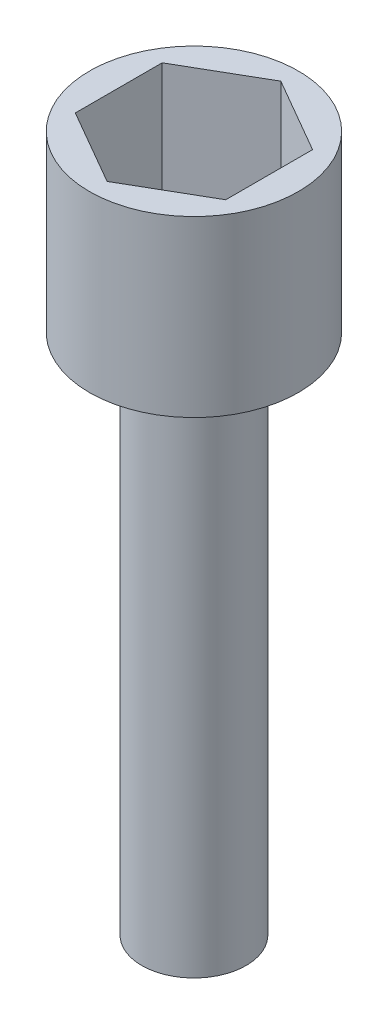
ISO-10303-21;
HEADER;
FILE_DESCRIPTION(('STEP AP214'),'2;1');
FILE_NAME('part.step','',(''),(''),'','','');
FILE_SCHEMA(('AUTOMOTIVE_DESIGN { 1 0 10303 214 1 1 1 1 }'));
ENDSEC;
DATA;
#1=APPLICATION_CONTEXT('core data for automotive mechanical design processes');
#2=APPLICATION_PROTOCOL_DEFINITION('international standard','automotive_design',2000,#1);
#3=PRODUCT_CONTEXT('',#1,'mechanical');
#4=PRODUCT('Part','Part','',(#3));
#5=PRODUCT_RELATED_PRODUCT_CATEGORY('part','',(#4));
#6=PRODUCT_DEFINITION_FORMATION('','',#4);
#7=PRODUCT_DEFINITION_CONTEXT('part definition',#1,'design');
#8=PRODUCT_DEFINITION('design','',#6,#7);
#9=PRODUCT_DEFINITION_SHAPE('','',#8);
#10=(LENGTH_UNIT() NAMED_UNIT(*) SI_UNIT(.MILLI.,.METRE.));
#11=(NAMED_UNIT(*) PLANE_ANGLE_UNIT() SI_UNIT($,.RADIAN.));
#12=(NAMED_UNIT(*) SI_UNIT($,.STERADIAN.) SOLID_ANGLE_UNIT());
#13=UNCERTAINTY_MEASURE_WITH_UNIT(LENGTH_MEASURE(1.E-05),#10,'distance_accuracy_value','');
#14=(GEOMETRIC_REPRESENTATION_CONTEXT(3) GLOBAL_UNCERTAINTY_ASSIGNED_CONTEXT((#13)) GLOBAL_UNIT_ASSIGNED_CONTEXT((#10,
#11,#12)) REPRESENTATION_CONTEXT('',''));
#15=CARTESIAN_POINT('',(0.,0.,0.));
#16=DIRECTION('',(0.,0.,1.));
#17=DIRECTION('',(1.,0.,0.));
#18=AXIS2_PLACEMENT_3D('',#15,#16,#17);
#19=CARTESIAN_POINT('',(0.,15.,0.));
#20=DIRECTION('',(0.,-1.,0.));
#21=DIRECTION('',(0.,0.,-1.));
#22=AXIS2_PLACEMENT_3D('',#19,#20,#21);
#23=CYLINDRICAL_SURFACE('',#22,1.5);
#24=CARTESIAN_POINT('',(0.,15.,0.));
#25=DIRECTION('',(0.,1.,0.));
#26=DIRECTION('',(0.,0.,1.));
#27=AXIS2_PLACEMENT_3D('',#24,#25,#26);
#28=CIRCLE('',#27,1.5);
#29=CARTESIAN_POINT('',(0.,15.,1.5));
#30=VERTEX_POINT('',#29);
#31=EDGE_CURVE('E11',#30,#30,#28,.T.);
#32=ORIENTED_EDGE('',*,*,#31,.F.);
#33=EDGE_LOOP('',(#32));
#34=FACE_BOUND('',#33,.T.);
#35=CARTESIAN_POINT('',(0.,0.,0.));
#36=DIRECTION('',(0.,1.,0.));
#37=DIRECTION('',(0.,0.,1.));
#38=AXIS2_PLACEMENT_3D('',#35,#36,#37);
#39=CIRCLE('',#38,1.5);
#40=CARTESIAN_POINT('',(0.,0.,1.5));
#41=VERTEX_POINT('',#40);
#42=EDGE_CURVE('E36',#41,#41,#39,.T.);
#43=ORIENTED_EDGE('',*,*,#42,.T.);
#44=EDGE_LOOP('',(#43));
#45=FACE_BOUND('',#44,.T.);
#46=ADVANCED_FACE('F33',(#34,#45),#23,.T.);
#47=CARTESIAN_POINT('',(0.,0.,0.));
#48=DIRECTION('',(0.,1.,0.));
#49=DIRECTION('',(0.,0.,1.));
#50=AXIS2_PLACEMENT_3D('',#47,#48,#49);
#51=PLANE('',#50);
#52=ORIENTED_EDGE('',*,*,#42,.F.);
#53=EDGE_LOOP('',(#52));
#54=FACE_BOUND('',#53,.T.);
#55=ADVANCED_FACE('F151',(#54),#51,.F.);
#56=CARTESIAN_POINT('',(0.,15.,0.));
#57=DIRECTION('',(0.,1.,0.));
#58=DIRECTION('',(0.,0.,1.));
#59=AXIS2_PLACEMENT_3D('',#56,#57,#58);
#60=PLANE('',#59);
#61=CARTESIAN_POINT('',(0.,15.,0.));
#62=DIRECTION('',(0.,1.,0.));
#63=DIRECTION('',(0.,0.,1.));
#64=AXIS2_PLACEMENT_3D('',#61,#62,#63);
#65=CIRCLE('',#64,3.);
#66=CARTESIAN_POINT('',(0.,15.,3.));
#67=VERTEX_POINT('',#66);
#68=EDGE_CURVE('E134',#67,#67,#65,.T.);
#69=ORIENTED_EDGE('',*,*,#68,.F.);
#70=EDGE_LOOP('',(#69));
#71=FACE_BOUND('',#70,.T.);
#72=ORIENTED_EDGE('',*,*,#31,.T.);
#73=EDGE_LOOP('',(#72));
#74=FACE_BOUND('',#73,.T.);
#75=ADVANCED_FACE('F148',(#71,#74),#60,.F.);
#76=CARTESIAN_POINT('',(0.,20.,0.));
#77=DIRECTION('',(0.,-1.,0.));
#78=DIRECTION('',(0.,0.,-1.));
#79=AXIS2_PLACEMENT_3D('',#76,#77,#78);
#80=CYLINDRICAL_SURFACE('',#79,3.);
#81=CARTESIAN_POINT('',(0.,20.,0.));
#82=DIRECTION('',(0.,1.,0.));
#83=DIRECTION('',(0.,0.,1.));
#84=AXIS2_PLACEMENT_3D('',#81,#82,#83);
#85=CIRCLE('',#84,3.);
#86=CARTESIAN_POINT('',(0.,20.,3.));
#87=VERTEX_POINT('',#86);
#88=EDGE_CURVE('E140',#87,#87,#85,.T.);
#89=ORIENTED_EDGE('',*,*,#88,.F.);
#90=EDGE_LOOP('',(#89));
#91=FACE_BOUND('',#90,.T.);
#92=ORIENTED_EDGE('',*,*,#68,.T.);
#93=EDGE_LOOP('',(#92));
#94=FACE_BOUND('',#93,.T.);
#95=ADVANCED_FACE('F146',(#91,#94),#80,.T.);
#96=CARTESIAN_POINT('',(0.,20.,0.));
#97=DIRECTION('',(0.,1.,0.));
#98=DIRECTION('',(0.,0.,1.));
#99=AXIS2_PLACEMENT_3D('',#96,#97,#98);
#100=PLANE('',#99);
#101=DIRECTION('',(-0.866025403784442,0.,-0.499999999999995));
#102=VECTOR('',#101,1.);
#103=CARTESIAN_POINT('',(2.15999302253973,20.,-1.24707255301106));
#104=LINE('',#103,#102);
#105=CARTESIAN_POINT('',(2.15999302253973,20.,-1.24707255301106));
#106=VERTEX_POINT('',#105);
#107=CARTESIAN_POINT('',(0.,20.,-2.49414510602207));
#108=VERTEX_POINT('',#107);
#109=EDGE_CURVE('E47',#106,#108,#104,.T.);
#110=ORIENTED_EDGE('',*,*,#109,.F.);
#111=DIRECTION('',(0.,0.,-1.));
#112=VECTOR('',#111,1.);
#113=CARTESIAN_POINT('',(2.15999302253976,20.,1.24707255301101));
#114=LINE('',#113,#112);
#115=CARTESIAN_POINT('',(2.15999302253976,20.,1.24707255301101));
#116=VERTEX_POINT('',#115);
#117=EDGE_CURVE('E130',#116,#106,#114,.T.);
#118=ORIENTED_EDGE('',*,*,#117,.F.);
#119=DIRECTION('',(0.866025403784434,0.,-0.500000000000007));
#120=VECTOR('',#119,1.);
#121=CARTESIAN_POINT('',(0.,20.,2.49414510602207));
#122=LINE('',#121,#120);
#123=CARTESIAN_POINT('',(0.,20.,2.49414510602207));
#124=VERTEX_POINT('',#123);
#125=EDGE_CURVE('E128',#124,#116,#122,.T.);
#126=ORIENTED_EDGE('',*,*,#125,.F.);
#127=DIRECTION('',(0.866025403784441,0.,0.499999999999995));
#128=VECTOR('',#127,1.);
#129=CARTESIAN_POINT('',(-2.15999302253974,20.,1.24707255301104));
#130=LINE('',#129,#128);
#131=CARTESIAN_POINT('',(-2.15999302253974,20.,1.24707255301104));
#132=VERTEX_POINT('',#131);
#133=EDGE_CURVE('E95',#132,#124,#130,.T.);
#134=ORIENTED_EDGE('',*,*,#133,.F.);
#135=DIRECTION('',(0.,0.,1.));
#136=VECTOR('',#135,1.);
#137=CARTESIAN_POINT('',(-2.15999302253975,20.,-1.24707255301103));
#138=LINE('',#137,#136);
#139=CARTESIAN_POINT('',(-2.15999302253975,20.,-1.24707255301103));
#140=VERTEX_POINT('',#139);
#141=EDGE_CURVE('E124',#140,#132,#138,.T.);
#142=ORIENTED_EDGE('',*,*,#141,.F.);
#143=DIRECTION('',(-0.866025403784438,0.,0.500000000000001));
#144=VECTOR('',#143,1.);
#145=CARTESIAN_POINT('',(0.,20.,-2.49414510602207));
#146=LINE('',#145,#144);
#147=EDGE_CURVE('E121',#108,#140,#146,.T.);
#148=ORIENTED_EDGE('',*,*,#147,.F.);
#149=EDGE_LOOP('',(#110,#118,#126,#134,#142,#148));
#150=FACE_BOUND('',#149,.T.);
#151=ORIENTED_EDGE('',*,*,#88,.T.);
#152=EDGE_LOOP('',(#151));
#153=FACE_BOUND('',#152,.T.);
#154=ADVANCED_FACE('F165',(#150,#153),#100,.T.);
#155=CARTESIAN_POINT('',(2.15999302253973,16.,-1.24707255301106));
#156=DIRECTION('',(0.499999999999995,0.,-0.866025403784441));
#157=DIRECTION('',(-0.866025403784442,0.,-0.499999999999995));
#158=AXIS2_PLACEMENT_3D('',#155,#156,#157);
#159=PLANE('',#158);
#160=ORIENTED_EDGE('',*,*,#109,.T.);
#161=DIRECTION('',(0.,1.,0.));
#162=VECTOR('',#161,1.);
#163=CARTESIAN_POINT('',(0.,16.,-2.49414510602207));
#164=LINE('',#163,#162);
#165=CARTESIAN_POINT('',(0.,16.,-2.49414510602207));
#166=VERTEX_POINT('',#165);
#167=EDGE_CURVE('E77',#166,#108,#164,.T.);
#168=ORIENTED_EDGE('',*,*,#167,.F.);
#169=DIRECTION('',(-0.866025403784442,0.,-0.499999999999995));
#170=VECTOR('',#169,1.);
#171=CARTESIAN_POINT('',(2.15999302253973,16.,-1.24707255301106));
#172=LINE('',#171,#170);
#173=CARTESIAN_POINT('',(2.15999302253973,16.,-1.24707255301106));
#174=VERTEX_POINT('',#173);
#175=EDGE_CURVE('E132',#174,#166,#172,.T.);
#176=ORIENTED_EDGE('',*,*,#175,.F.);
#177=DIRECTION('',(0.,1.,0.));
#178=VECTOR('',#177,1.);
#179=CARTESIAN_POINT('',(2.15999302253973,16.,-1.24707255301106));
#180=LINE('',#179,#178);
#181=EDGE_CURVE('E55',#174,#106,#180,.T.);
#182=ORIENTED_EDGE('',*,*,#181,.T.);
#183=EDGE_LOOP('',(#160,#168,#176,#182));
#184=FACE_BOUND('',#183,.T.);
#185=ADVANCED_FACE('F170',(#184),#159,.F.);
#186=CARTESIAN_POINT('',(2.15999302253976,16.,1.24707255301101));
#187=DIRECTION('',(1.,0.,0.));
#188=DIRECTION('',(0.,0.,-1.));
#189=AXIS2_PLACEMENT_3D('',#186,#187,#188);
#190=PLANE('',#189);
#191=ORIENTED_EDGE('',*,*,#117,.T.);
#192=ORIENTED_EDGE('',*,*,#181,.F.);
#193=DIRECTION('',(0.,0.,-1.));
#194=VECTOR('',#193,1.);
#195=CARTESIAN_POINT('',(2.15999302253976,16.,1.24707255301101));
#196=LINE('',#195,#194);
#197=CARTESIAN_POINT('',(2.15999302253976,16.,1.24707255301101));
#198=VERTEX_POINT('',#197);
#199=EDGE_CURVE('E107',#198,#174,#196,.T.);
#200=ORIENTED_EDGE('',*,*,#199,.F.);
#201=DIRECTION('',(0.,1.,0.));
#202=VECTOR('',#201,1.);
#203=CARTESIAN_POINT('',(2.15999302253976,16.,1.24707255301101));
#204=LINE('',#203,#202);
#205=EDGE_CURVE('E99',#198,#116,#204,.T.);
#206=ORIENTED_EDGE('',*,*,#205,.T.);
#207=EDGE_LOOP('',(#191,#192,#200,#206));
#208=FACE_BOUND('',#207,.T.);
#209=ADVANCED_FACE('F174',(#208),#190,.F.);
#210=CARTESIAN_POINT('',(0.,16.,2.49414510602207));
#211=DIRECTION('',(0.500000000000007,0.,0.866025403784434));
#212=DIRECTION('',(0.866025403784434,0.,-0.500000000000007));
#213=AXIS2_PLACEMENT_3D('',#210,#211,#212);
#214=PLANE('',#213);
#215=ORIENTED_EDGE('',*,*,#125,.T.);
#216=ORIENTED_EDGE('',*,*,#205,.F.);
#217=DIRECTION('',(0.866025403784434,0.,-0.500000000000007));
#218=VECTOR('',#217,1.);
#219=CARTESIAN_POINT('',(0.,16.,2.49414510602207));
#220=LINE('',#219,#218);
#221=CARTESIAN_POINT('',(0.,16.,2.49414510602207));
#222=VERTEX_POINT('',#221);
#223=EDGE_CURVE('E103',#222,#198,#220,.T.);
#224=ORIENTED_EDGE('',*,*,#223,.F.);
#225=DIRECTION('',(0.,1.,0.));
#226=VECTOR('',#225,1.);
#227=CARTESIAN_POINT('',(0.,16.,2.49414510602207));
#228=LINE('',#227,#226);
#229=EDGE_CURVE('E88',#222,#124,#228,.T.);
#230=ORIENTED_EDGE('',*,*,#229,.T.);
#231=EDGE_LOOP('',(#215,#216,#224,#230));
#232=FACE_BOUND('',#231,.T.);
#233=ADVANCED_FACE('F104',(#232),#214,.F.);
#234=CARTESIAN_POINT('',(-2.15999302253974,16.,1.24707255301104));
#235=DIRECTION('',(-0.499999999999995,0.,0.866025403784441));
#236=DIRECTION('',(0.866025403784442,0.,0.499999999999995));
#237=AXIS2_PLACEMENT_3D('',#234,#235,#236);
#238=PLANE('',#237);
#239=ORIENTED_EDGE('',*,*,#133,.T.);
#240=ORIENTED_EDGE('',*,*,#229,.F.);
#241=DIRECTION('',(0.866025403784441,0.,0.499999999999995));
#242=VECTOR('',#241,1.);
#243=CARTESIAN_POINT('',(-2.15999302253974,16.,1.24707255301104));
#244=LINE('',#243,#242);
#245=CARTESIAN_POINT('',(-2.15999302253974,16.,1.24707255301104));
#246=VERTEX_POINT('',#245);
#247=EDGE_CURVE('E92',#246,#222,#244,.T.);
#248=ORIENTED_EDGE('',*,*,#247,.F.);
#249=DIRECTION('',(0.,1.,0.));
#250=VECTOR('',#249,1.);
#251=CARTESIAN_POINT('',(-2.15999302253974,16.,1.24707255301104));
#252=LINE('',#251,#250);
#253=EDGE_CURVE('E100',#246,#132,#252,.T.);
#254=ORIENTED_EDGE('',*,*,#253,.T.);
#255=EDGE_LOOP('',(#239,#240,#248,#254));
#256=FACE_BOUND('',#255,.T.);
#257=ADVANCED_FACE('F90',(#256),#238,.F.);
#258=CARTESIAN_POINT('',(-2.15999302253975,16.,-1.24707255301103));
#259=DIRECTION('',(-1.,0.,0.));
#260=DIRECTION('',(0.,0.,1.));
#261=AXIS2_PLACEMENT_3D('',#258,#259,#260);
#262=PLANE('',#261);
#263=ORIENTED_EDGE('',*,*,#141,.T.);
#264=ORIENTED_EDGE('',*,*,#253,.F.);
#265=DIRECTION('',(0.,0.,1.));
#266=VECTOR('',#265,1.);
#267=CARTESIAN_POINT('',(-2.15999302253975,16.,-1.24707255301103));
#268=LINE('',#267,#266);
#269=CARTESIAN_POINT('',(-2.15999302253975,16.,-1.24707255301103));
#270=VERTEX_POINT('',#269);
#271=EDGE_CURVE('E113',#270,#246,#268,.T.);
#272=ORIENTED_EDGE('',*,*,#271,.F.);
#273=DIRECTION('',(0.,1.,0.));
#274=VECTOR('',#273,1.);
#275=CARTESIAN_POINT('',(-2.15999302253975,16.,-1.24707255301103));
#276=LINE('',#275,#274);
#277=EDGE_CURVE('E137',#270,#140,#276,.T.);
#278=ORIENTED_EDGE('',*,*,#277,.T.);
#279=EDGE_LOOP('',(#263,#264,#272,#278));
#280=FACE_BOUND('',#279,.T.);
#281=ADVANCED_FACE('F178',(#280),#262,.F.);
#282=CARTESIAN_POINT('',(0.,16.,-2.49414510602207));
#283=DIRECTION('',(-0.500000000000001,0.,-0.866025403784438));
#284=DIRECTION('',(-0.866025403784438,0.,0.500000000000001));
#285=AXIS2_PLACEMENT_3D('',#282,#283,#284);
#286=PLANE('',#285);
#287=ORIENTED_EDGE('',*,*,#147,.T.);
#288=ORIENTED_EDGE('',*,*,#277,.F.);
#289=DIRECTION('',(-0.866025403784438,0.,0.500000000000001));
#290=VECTOR('',#289,1.);
#291=CARTESIAN_POINT('',(0.,16.,-2.49414510602207));
#292=LINE('',#291,#290);
#293=EDGE_CURVE('E115',#166,#270,#292,.T.);
#294=ORIENTED_EDGE('',*,*,#293,.F.);
#295=ORIENTED_EDGE('',*,*,#167,.T.);
#296=EDGE_LOOP('',(#287,#288,#294,#295));
#297=FACE_BOUND('',#296,.T.);
#298=ADVANCED_FACE('F175',(#297),#286,.F.);
#299=CARTESIAN_POINT('',(0.,16.,0.));
#300=DIRECTION('',(0.,1.,0.));
#301=DIRECTION('',(0.,0.,1.));
#302=AXIS2_PLACEMENT_3D('',#299,#300,#301);
#303=PLANE('',#302);
#304=ORIENTED_EDGE('',*,*,#175,.T.);
#305=ORIENTED_EDGE('',*,*,#293,.T.);
#306=ORIENTED_EDGE('',*,*,#271,.T.);
#307=ORIENTED_EDGE('',*,*,#247,.T.);
#308=ORIENTED_EDGE('',*,*,#223,.T.);
#309=ORIENTED_EDGE('',*,*,#199,.T.);
#310=EDGE_LOOP('',(#304,#305,#306,#307,#308,#309));
#311=FACE_BOUND('',#310,.T.);
#312=ADVANCED_FACE('F110',(#311),#303,.T.);
#313=CLOSED_SHELL('',(#46,#55,#75,#95,#154,#185,#209,#233,#257,#281,#298,#312));
#314=MANIFOLD_SOLID_BREP('B2',#313);
#315=ADVANCED_BREP_SHAPE_REPRESENTATION('',(#18,#314),#14);
#316=SHAPE_DEFINITION_REPRESENTATION(#9,#315);
ENDSEC;
END-ISO-10303-21;
